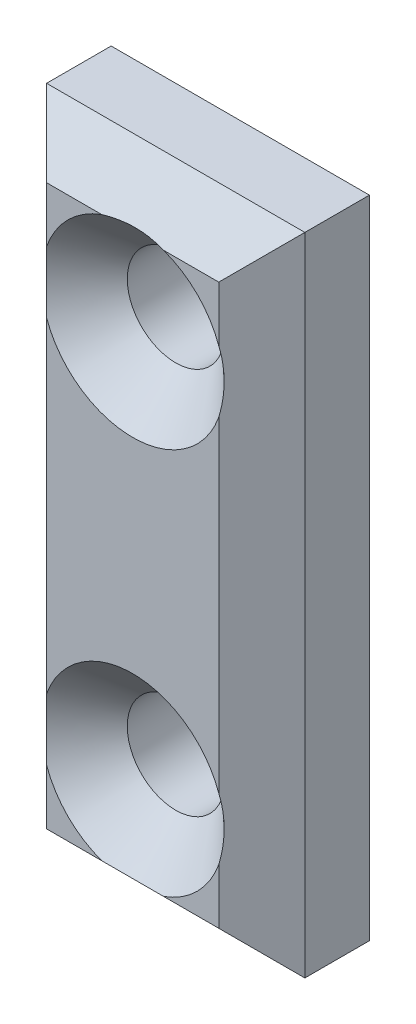
ISO-10303-21;
HEADER;
FILE_DESCRIPTION(('STEP AP214'),'2;1');
FILE_NAME('part.step','',(''),(''),'','','');
FILE_SCHEMA(('AUTOMOTIVE_DESIGN { 1 0 10303 214 1 1 1 1 }'));
ENDSEC;
DATA;
#1=APPLICATION_CONTEXT('core data for automotive mechanical design processes');
#2=APPLICATION_PROTOCOL_DEFINITION('international standard','automotive_design',2000,#1);
#3=PRODUCT_CONTEXT('',#1,'mechanical');
#4=PRODUCT('Part','Part','',(#3));
#5=PRODUCT_RELATED_PRODUCT_CATEGORY('part','',(#4));
#6=PRODUCT_DEFINITION_FORMATION('','',#4);
#7=PRODUCT_DEFINITION_CONTEXT('part definition',#1,'design');
#8=PRODUCT_DEFINITION('design','',#6,#7);
#9=PRODUCT_DEFINITION_SHAPE('','',#8);
#10=(LENGTH_UNIT() NAMED_UNIT(*) SI_UNIT(.MILLI.,.METRE.));
#11=(NAMED_UNIT(*) PLANE_ANGLE_UNIT() SI_UNIT($,.RADIAN.));
#12=(NAMED_UNIT(*) SI_UNIT($,.STERADIAN.) SOLID_ANGLE_UNIT());
#13=UNCERTAINTY_MEASURE_WITH_UNIT(LENGTH_MEASURE(1.E-05),#10,'distance_accuracy_value','');
#14=(GEOMETRIC_REPRESENTATION_CONTEXT(3) GLOBAL_UNCERTAINTY_ASSIGNED_CONTEXT((#13)) GLOBAL_UNIT_ASSIGNED_CONTEXT((#10,
#11,#12)) REPRESENTATION_CONTEXT('',''));
#15=CARTESIAN_POINT('',(0.,0.,0.));
#16=DIRECTION('',(0.,0.,1.));
#17=DIRECTION('',(1.,0.,0.));
#18=AXIS2_PLACEMENT_3D('',#15,#16,#17);
#19=CARTESIAN_POINT('',(0.,0.,5.));
#20=DIRECTION('',(0.,0.,-1.));
#21=DIRECTION('',(-1.,0.,0.));
#22=AXIS2_PLACEMENT_3D('',#19,#20,#21);
#23=PLANE('',#22);
#24=DIRECTION('',(1.,0.,0.));
#25=VECTOR('',#24,1.);
#26=CARTESIAN_POINT('',(0.,45.8000000000001,5.));
#27=LINE('',#26,#25);
#28=CARTESIAN_POINT('',(128.997861571869,45.7999999999999,5.));
#29=VERTEX_POINT('',#28);
#30=CARTESIAN_POINT('',(131.561720910235,45.7999999999999,5.));
#31=VERTEX_POINT('',#30);
#32=EDGE_CURVE('E199',#29,#31,#27,.T.);
#33=ORIENTED_EDGE('',*,*,#32,.T.);
#34=DIRECTION('',(0.,1.,0.));
#35=VECTOR('',#34,1.);
#36=CARTESIAN_POINT('',(131.561720910235,0.,5.));
#37=LINE('',#36,#35);
#38=CARTESIAN_POINT('',(131.561720910235,48.3638593383654,5.));
#39=VERTEX_POINT('',#38);
#40=EDGE_CURVE('E201',#31,#39,#37,.T.);
#41=ORIENTED_EDGE('',*,*,#40,.T.);
#42=CARTESIAN_POINT('',(127.561720910235,49.8,5.));
#43=DIRECTION('',(0.,0.,-1.));
#44=DIRECTION('',(-1.,0.,0.));
#45=AXIS2_PLACEMENT_3D('',#42,#43,#44);
#46=CIRCLE('',#45,4.25000000000003);
#47=EDGE_CURVE('E197',#39,#29,#46,.T.);
#48=ORIENTED_EDGE('',*,*,#47,.T.);
#49=EDGE_LOOP('',(#33,#41,#48));
#50=FACE_BOUND('',#49,.T.);
#51=ADVANCED_FACE('F35',(#50),#23,.F.);
#52=DIRECTION('',(0.,-1.,0.));
#53=VECTOR('',#52,1.);
#54=CARTESIAN_POINT('',(123.561720910235,0.,5.));
#55=LINE('',#54,#53);
#56=CARTESIAN_POINT('',(123.561720910235,48.3638593383654,5.));
#57=VERTEX_POINT('',#56);
#58=CARTESIAN_POINT('',(123.561720910235,45.8,5.));
#59=VERTEX_POINT('',#58);
#60=EDGE_CURVE('E192',#57,#59,#55,.T.);
#61=ORIENTED_EDGE('',*,*,#60,.T.);
#62=DIRECTION('',(1.,0.,0.));
#63=VECTOR('',#62,1.);
#64=CARTESIAN_POINT('',(0.,45.8000000000001,5.));
#65=LINE('',#64,#63);
#66=CARTESIAN_POINT('',(126.1255802486,45.7999999999999,5.));
#67=VERTEX_POINT('',#66);
#68=EDGE_CURVE('E194',#59,#67,#65,.T.);
#69=ORIENTED_EDGE('',*,*,#68,.T.);
#70=CARTESIAN_POINT('',(127.561720910235,49.8,5.));
#71=DIRECTION('',(0.,0.,-1.));
#72=DIRECTION('',(-1.,0.,0.));
#73=AXIS2_PLACEMENT_3D('',#70,#71,#72);
#74=CIRCLE('',#73,4.25000000000003);
#75=EDGE_CURVE('E190',#67,#57,#74,.T.);
#76=ORIENTED_EDGE('',*,*,#75,.T.);
#77=EDGE_LOOP('',(#61,#69,#76));
#78=FACE_BOUND('',#77,.T.);
#79=ADVANCED_FACE('F329',(#78),#23,.F.);
#80=CARTESIAN_POINT('',(127.561720910235,67.7999999999999,5.));
#81=DIRECTION('',(0.,0.,-1.));
#82=DIRECTION('',(-1.,0.,0.));
#83=AXIS2_PLACEMENT_3D('',#80,#81,#82);
#84=CIRCLE('',#83,4.25000000000003);
#85=CARTESIAN_POINT('',(123.561720910235,69.2361406616345,5.));
#86=VERTEX_POINT('',#85);
#87=CARTESIAN_POINT('',(126.1255802486,71.8,5.));
#88=VERTEX_POINT('',#87);
#89=EDGE_CURVE('E183',#86,#88,#84,.T.);
#90=ORIENTED_EDGE('',*,*,#89,.T.);
#91=DIRECTION('',(-1.,0.,0.));
#92=VECTOR('',#91,1.);
#93=CARTESIAN_POINT('',(0.,71.8000000000001,5.));
#94=LINE('',#93,#92);
#95=CARTESIAN_POINT('',(123.561720910235,71.8,5.));
#96=VERTEX_POINT('',#95);
#97=EDGE_CURVE('E187',#88,#96,#94,.T.);
#98=ORIENTED_EDGE('',*,*,#97,.T.);
#99=DIRECTION('',(0.,-1.,0.));
#100=VECTOR('',#99,1.);
#101=CARTESIAN_POINT('',(123.561720910235,0.,5.));
#102=LINE('',#101,#100);
#103=EDGE_CURVE('E185',#96,#86,#102,.T.);
#104=ORIENTED_EDGE('',*,*,#103,.T.);
#105=EDGE_LOOP('',(#90,#98,#104));
#106=FACE_BOUND('',#105,.T.);
#107=ADVANCED_FACE('F334',(#106),#23,.F.);
#108=DIRECTION('',(0.,1.,0.));
#109=VECTOR('',#108,1.);
#110=CARTESIAN_POINT('',(131.561720910235,0.,5.));
#111=LINE('',#110,#109);
#112=CARTESIAN_POINT('',(131.561720910235,69.2361406616345,5.));
#113=VERTEX_POINT('',#112);
#114=CARTESIAN_POINT('',(131.561720910235,71.8,5.));
#115=VERTEX_POINT('',#114);
#116=EDGE_CURVE('E178',#113,#115,#111,.T.);
#117=ORIENTED_EDGE('',*,*,#116,.T.);
#118=DIRECTION('',(-1.,0.,0.));
#119=VECTOR('',#118,1.);
#120=CARTESIAN_POINT('',(0.,71.8000000000001,5.));
#121=LINE('',#120,#119);
#122=CARTESIAN_POINT('',(128.997861571869,71.8,5.));
#123=VERTEX_POINT('',#122);
#124=EDGE_CURVE('E180',#115,#123,#121,.T.);
#125=ORIENTED_EDGE('',*,*,#124,.T.);
#126=CARTESIAN_POINT('',(127.561720910235,67.7999999999999,5.));
#127=DIRECTION('',(0.,0.,-1.));
#128=DIRECTION('',(-1.,0.,0.));
#129=AXIS2_PLACEMENT_3D('',#126,#127,#128);
#130=CIRCLE('',#129,4.25000000000003);
#131=EDGE_CURVE('E176',#123,#113,#130,.T.);
#132=ORIENTED_EDGE('',*,*,#131,.T.);
#133=EDGE_LOOP('',(#117,#125,#132));
#134=FACE_BOUND('',#133,.T.);
#135=ADVANCED_FACE('F339',(#134),#23,.F.);
#136=CARTESIAN_POINT('',(121.561720910235,73.8,5.));
#137=DIRECTION('',(1.,0.,0.));
#138=DIRECTION('',(0.,0.,-1.));
#139=AXIS2_PLACEMENT_3D('',#136,#137,#138);
#140=PLANE('',#139);
#141=DIRECTION('',(0.,0.,-1.));
#142=VECTOR('',#141,1.);
#143=CARTESIAN_POINT('',(121.561720910235,43.8,5.));
#144=LINE('',#143,#142);
#145=CARTESIAN_POINT('',(121.561720910235,43.8,2.99999999999999));
#146=VERTEX_POINT('',#145);
#147=CARTESIAN_POINT('',(121.561720910235,43.8,0.));
#148=VERTEX_POINT('',#147);
#149=EDGE_CURVE('E131',#146,#148,#144,.T.);
#150=ORIENTED_EDGE('',*,*,#149,.F.);
#151=DIRECTION('',(0.,1.,0.));
#152=VECTOR('',#151,1.);
#153=CARTESIAN_POINT('',(121.561720910235,73.8,2.99999999999999));
#154=LINE('',#153,#152);
#155=CARTESIAN_POINT('',(121.561720910235,73.8,2.99999999999999));
#156=VERTEX_POINT('',#155);
#157=EDGE_CURVE('E209',#146,#156,#154,.T.);
#158=ORIENTED_EDGE('',*,*,#157,.T.);
#159=DIRECTION('',(0.,0.,-1.));
#160=VECTOR('',#159,1.);
#161=CARTESIAN_POINT('',(121.561720910235,73.8,5.));
#162=LINE('',#161,#160);
#163=CARTESIAN_POINT('',(121.561720910235,73.8,0.));
#164=VERTEX_POINT('',#163);
#165=EDGE_CURVE('E152',#156,#164,#162,.T.);
#166=ORIENTED_EDGE('',*,*,#165,.T.);
#167=DIRECTION('',(0.,-1.,0.));
#168=VECTOR('',#167,1.);
#169=CARTESIAN_POINT('',(121.561720910235,73.8,0.));
#170=LINE('',#169,#168);
#171=EDGE_CURVE('E146',#164,#148,#170,.T.);
#172=ORIENTED_EDGE('',*,*,#171,.T.);
#173=EDGE_LOOP('',(#150,#158,#166,#172));
#174=FACE_BOUND('',#173,.T.);
#175=ADVANCED_FACE('F150',(#174),#140,.F.);
#176=CARTESIAN_POINT('',(133.561720910235,43.7999999999999,5.));
#177=DIRECTION('',(0.,1.,0.));
#178=DIRECTION('',(-1.,0.,0.));
#179=AXIS2_PLACEMENT_3D('',#176,#177,#178);
#180=PLANE('',#179);
#181=DIRECTION('',(0.,0.,-1.));
#182=VECTOR('',#181,1.);
#183=CARTESIAN_POINT('',(133.561720910235,43.7999999999999,5.));
#184=LINE('',#183,#182);
#185=CARTESIAN_POINT('',(133.561720910235,43.7999999999999,2.99999999999999));
#186=VERTEX_POINT('',#185);
#187=CARTESIAN_POINT('',(133.561720910235,43.7999999999999,0.));
#188=VERTEX_POINT('',#187);
#189=EDGE_CURVE('E140',#186,#188,#184,.T.);
#190=ORIENTED_EDGE('',*,*,#189,.F.);
#191=DIRECTION('',(-1.,0.,0.));
#192=VECTOR('',#191,1.);
#193=CARTESIAN_POINT('',(133.561720910235,43.7999999999999,2.99999999999999));
#194=LINE('',#193,#192);
#195=EDGE_CURVE('E58',#186,#146,#194,.T.);
#196=ORIENTED_EDGE('',*,*,#195,.T.);
#197=ORIENTED_EDGE('',*,*,#149,.T.);
#198=DIRECTION('',(1.,0.,0.));
#199=VECTOR('',#198,1.);
#200=CARTESIAN_POINT('',(133.561720910235,43.7999999999999,0.));
#201=LINE('',#200,#199);
#202=EDGE_CURVE('E134',#148,#188,#201,.T.);
#203=ORIENTED_EDGE('',*,*,#202,.T.);
#204=EDGE_LOOP('',(#190,#196,#197,#203));
#205=FACE_BOUND('',#204,.T.);
#206=ADVANCED_FACE('F133',(#205),#180,.F.);
#207=CARTESIAN_POINT('',(133.561720910235,73.8,5.));
#208=DIRECTION('',(-1.,0.,0.));
#209=DIRECTION('',(0.,0.,1.));
#210=AXIS2_PLACEMENT_3D('',#207,#208,#209);
#211=PLANE('',#210);
#212=DIRECTION('',(0.,0.,-1.));
#213=VECTOR('',#212,1.);
#214=CARTESIAN_POINT('',(133.561720910235,73.8,5.));
#215=LINE('',#214,#213);
#216=CARTESIAN_POINT('',(133.561720910235,73.8,2.99999999999999));
#217=VERTEX_POINT('',#216);
#218=CARTESIAN_POINT('',(133.561720910235,73.8,0.));
#219=VERTEX_POINT('',#218);
#220=EDGE_CURVE('E165',#217,#219,#215,.T.);
#221=ORIENTED_EDGE('',*,*,#220,.F.);
#222=DIRECTION('',(0.,-1.,0.));
#223=VECTOR('',#222,1.);
#224=CARTESIAN_POINT('',(133.561720910235,73.8,2.99999999999999));
#225=LINE('',#224,#223);
#226=EDGE_CURVE('E66',#217,#186,#225,.T.);
#227=ORIENTED_EDGE('',*,*,#226,.T.);
#228=ORIENTED_EDGE('',*,*,#189,.T.);
#229=DIRECTION('',(0.,1.,0.));
#230=VECTOR('',#229,1.);
#231=CARTESIAN_POINT('',(133.561720910235,73.8,0.));
#232=LINE('',#231,#230);
#233=EDGE_CURVE('E148',#188,#219,#232,.T.);
#234=ORIENTED_EDGE('',*,*,#233,.T.);
#235=EDGE_LOOP('',(#221,#227,#228,#234));
#236=FACE_BOUND('',#235,.T.);
#237=ADVANCED_FACE('F343',(#236),#211,.F.);
#238=CARTESIAN_POINT('',(133.561720910235,73.8,5.));
#239=DIRECTION('',(0.,-1.,0.));
#240=DIRECTION('',(1.,0.,0.));
#241=AXIS2_PLACEMENT_3D('',#238,#239,#240);
#242=PLANE('',#241);
#243=ORIENTED_EDGE('',*,*,#165,.F.);
#244=DIRECTION('',(1.,0.,0.));
#245=VECTOR('',#244,1.);
#246=CARTESIAN_POINT('',(133.561720910235,73.8,2.99999999999999));
#247=LINE('',#246,#245);
#248=EDGE_CURVE('E204',#156,#217,#247,.T.);
#249=ORIENTED_EDGE('',*,*,#248,.T.);
#250=ORIENTED_EDGE('',*,*,#220,.T.);
#251=DIRECTION('',(-1.,0.,0.));
#252=VECTOR('',#251,1.);
#253=CARTESIAN_POINT('',(133.561720910235,73.8,0.));
#254=LINE('',#253,#252);
#255=EDGE_CURVE('E162',#219,#164,#254,.T.);
#256=ORIENTED_EDGE('',*,*,#255,.T.);
#257=EDGE_LOOP('',(#243,#249,#250,#256));
#258=FACE_BOUND('',#257,.T.);
#259=ADVANCED_FACE('F337',(#258),#242,.F.);
#260=DIRECTION('',(0.,-1.,0.));
#261=VECTOR('',#260,1.);
#262=CARTESIAN_POINT('',(123.561720910235,0.,5.));
#263=LINE('',#262,#261);
#264=CARTESIAN_POINT('',(123.561720910235,66.3638593383654,5.));
#265=VERTEX_POINT('',#264);
#266=CARTESIAN_POINT('',(123.561720910235,51.2361406616345,5.));
#267=VERTEX_POINT('',#266);
#268=EDGE_CURVE('E169',#265,#267,#263,.T.);
#269=ORIENTED_EDGE('',*,*,#268,.T.);
#270=CARTESIAN_POINT('',(127.561720910235,49.8,5.));
#271=DIRECTION('',(0.,0.,-1.));
#272=DIRECTION('',(-1.,0.,0.));
#273=AXIS2_PLACEMENT_3D('',#270,#271,#272);
#274=CIRCLE('',#273,4.25000000000003);
#275=CARTESIAN_POINT('',(131.561720910235,51.2361406616345,5.));
#276=VERTEX_POINT('',#275);
#277=EDGE_CURVE('E174',#267,#276,#274,.T.);
#278=ORIENTED_EDGE('',*,*,#277,.T.);
#279=DIRECTION('',(0.,1.,0.));
#280=VECTOR('',#279,1.);
#281=CARTESIAN_POINT('',(131.561720910235,0.,5.));
#282=LINE('',#281,#280);
#283=CARTESIAN_POINT('',(131.561720910235,66.3638593383653,5.));
#284=VERTEX_POINT('',#283);
#285=EDGE_CURVE('E171',#276,#284,#282,.T.);
#286=ORIENTED_EDGE('',*,*,#285,.T.);
#287=CARTESIAN_POINT('',(127.561720910235,67.7999999999999,5.));
#288=DIRECTION('',(0.,0.,-1.));
#289=DIRECTION('',(-1.,0.,0.));
#290=AXIS2_PLACEMENT_3D('',#287,#288,#289);
#291=CIRCLE('',#290,4.25000000000003);
#292=EDGE_CURVE('E139',#284,#265,#291,.T.);
#293=ORIENTED_EDGE('',*,*,#292,.T.);
#294=EDGE_LOOP('',(#269,#278,#286,#293));
#295=FACE_BOUND('',#294,.T.);
#296=ADVANCED_FACE('F324',(#295),#23,.F.);
#297=CARTESIAN_POINT('',(0.,0.,0.));
#298=DIRECTION('',(0.,0.,-1.));
#299=DIRECTION('',(-1.,0.,0.));
#300=AXIS2_PLACEMENT_3D('',#297,#298,#299);
#301=PLANE('',#300);
#302=CARTESIAN_POINT('',(127.561720910235,67.7999999999999,0.));
#303=DIRECTION('',(0.,0.,1.));
#304=DIRECTION('',(1.,0.,0.));
#305=AXIS2_PLACEMENT_3D('',#302,#303,#304);
#306=CIRCLE('',#305,2.25000000000001);
#307=CARTESIAN_POINT('',(129.811720910235,67.7999999999999,0.));
#308=VERTEX_POINT('',#307);
#309=EDGE_CURVE('E154',#308,#308,#306,.T.);
#310=ORIENTED_EDGE('',*,*,#309,.T.);
#311=EDGE_LOOP('',(#310));
#312=FACE_BOUND('',#311,.T.);
#313=CARTESIAN_POINT('',(127.561720910235,49.8,0.));
#314=DIRECTION('',(0.,0.,1.));
#315=DIRECTION('',(1.,0.,0.));
#316=AXIS2_PLACEMENT_3D('',#313,#314,#315);
#317=CIRCLE('',#316,2.25000000000001);
#318=CARTESIAN_POINT('',(129.811720910235,49.8,0.));
#319=VERTEX_POINT('',#318);
#320=EDGE_CURVE('E157',#319,#319,#317,.T.);
#321=ORIENTED_EDGE('',*,*,#320,.T.);
#322=EDGE_LOOP('',(#321));
#323=FACE_BOUND('',#322,.T.);
#324=ORIENTED_EDGE('',*,*,#171,.F.);
#325=ORIENTED_EDGE('',*,*,#255,.F.);
#326=ORIENTED_EDGE('',*,*,#233,.F.);
#327=ORIENTED_EDGE('',*,*,#202,.F.);
#328=EDGE_LOOP('',(#324,#325,#326,#327));
#329=FACE_BOUND('',#328,.T.);
#330=ADVANCED_FACE('F144',(#312,#323,#329),#301,.T.);
#331=CARTESIAN_POINT('',(127.561720910235,49.8,0.));
#332=DIRECTION('',(0.,0.,1.));
#333=DIRECTION('',(1.,0.,0.));
#334=AXIS2_PLACEMENT_3D('',#331,#332,#333);
#335=CYLINDRICAL_SURFACE('',#334,2.25000000000001);
#336=CARTESIAN_POINT('',(127.561720910235,49.8,3.00000000000001));
#337=DIRECTION('',(0.,0.,-1.));
#338=DIRECTION('',(-1.,0.,0.));
#339=AXIS2_PLACEMENT_3D('',#336,#337,#338);
#340=CIRCLE('',#339,2.25000000000001);
#341=CARTESIAN_POINT('',(125.311720910235,49.8,3.00000000000001));
#342=VERTEX_POINT('',#341);
#343=EDGE_CURVE('E50',#342,#342,#340,.F.);
#344=ORIENTED_EDGE('',*,*,#343,.T.);
#345=EDGE_LOOP('',(#344));
#346=FACE_BOUND('',#345,.T.);
#347=ORIENTED_EDGE('',*,*,#320,.F.);
#348=EDGE_LOOP('',(#347));
#349=FACE_BOUND('',#348,.T.);
#350=ADVANCED_FACE('F313',(#346,#349),#335,.F.);
#351=CARTESIAN_POINT('',(127.561720910235,67.7999999999999,0.));
#352=DIRECTION('',(0.,0.,1.));
#353=DIRECTION('',(1.,0.,0.));
#354=AXIS2_PLACEMENT_3D('',#351,#352,#353);
#355=CYLINDRICAL_SURFACE('',#354,2.25000000000001);
#356=CARTESIAN_POINT('',(127.561720910235,67.7999999999999,3.00000000000001));
#357=DIRECTION('',(0.,0.,-1.));
#358=DIRECTION('',(-1.,0.,0.));
#359=AXIS2_PLACEMENT_3D('',#356,#357,#358);
#360=CIRCLE('',#359,2.25000000000001);
#361=CARTESIAN_POINT('',(125.311720910235,67.7999999999999,3.00000000000001));
#362=VERTEX_POINT('',#361);
#363=EDGE_CURVE('E11',#362,#362,#360,.F.);
#364=ORIENTED_EDGE('',*,*,#363,.T.);
#365=EDGE_LOOP('',(#364));
#366=FACE_BOUND('',#365,.T.);
#367=ORIENTED_EDGE('',*,*,#309,.F.);
#368=EDGE_LOOP('',(#367));
#369=FACE_BOUND('',#368,.T.);
#370=ADVANCED_FACE('F315',(#366,#369),#355,.F.);
#371=CARTESIAN_POINT('',(127.561720910235,49.8,3.00000000000001));
#372=DIRECTION('',(0.,0.,1.));
#373=DIRECTION('',(1.,0.,0.));
#374=AXIS2_PLACEMENT_3D('',#371,#372,#373);
#375=CONICAL_SURFACE('',#374,2.25000000000001,0.785398163397452);
#376=ORIENTED_EDGE('',*,*,#343,.F.);
#377=EDGE_LOOP('',(#376));
#378=FACE_BOUND('',#377,.T.);
#379=CARTESIAN_POINT('',(123.561920910235,48.3627108850338,5.00020000000001));
#380=CARTESIAN_POINT('',(123.547414359578,48.4459722404877,4.98569344934279));
#381=CARTESIAN_POINT('',(123.534099835369,48.5296410151836,4.97237892513408));
#382=CARTESIAN_POINT('',(123.509933883969,48.6976953628991,4.94821297373448));
#383=CARTESIAN_POINT('',(123.499082711793,48.7820810091941,4.93736180155781));
#384=CARTESIAN_POINT('',(123.47034140915,49.0361892496429,4.9086204989152));
#385=CARTESIAN_POINT('',(123.456271993907,49.2068147653422,4.89455108367239));
#386=CARTESIAN_POINT('',(123.438937630064,49.545630527511,4.87721671982945));
#387=CARTESIAN_POINT('',(123.435457730987,49.713799271163,4.87373682075224));
#388=CARTESIAN_POINT('',(123.438795746973,50.0498611499362,4.87707483673857));
#389=CARTESIAN_POINT('',(123.44560747198,50.2177543899721,4.88388656174535));
#390=CARTESIAN_POINT('',(123.462520304693,50.4563670753133,4.90079939445824));
#391=CARTESIAN_POINT('',(123.468508363419,50.5277136689155,4.90678745318428));
#392=CARTESIAN_POINT('',(123.482292231733,50.670047129047,4.92057132149821));
#393=CARTESIAN_POINT('',(123.490087744357,50.7410340527142,4.92836683412231));
#394=CARTESIAN_POINT('',(123.516278187135,50.9546084061553,4.95455727690008));
#395=CARTESIAN_POINT('',(123.537386260604,51.0965420152081,4.97566535036883));
#396=CARTESIAN_POINT('',(123.561920910235,51.2372891149672,5.00020000000019));
#397=B_SPLINE_CURVE_WITH_KNOTS('',3,(#379,#380,#381,#382,#383,#384,#385,#386,#387,#388,#389,
#390,#391,#392,#393,#394,#395,#396),.UNSPECIFIED.,.F.,.F.,(4,2,2,2,2,2,2,2,4),(0.,
0.257219659565787,0.514465935216324,1.02910756528189,1.53323066046739,2.03705066369039,
2.2525567742225,2.46802750226489,2.90278147625325),.UNSPECIFIED.);
#398=EDGE_CURVE('E253',#57,#267,#397,.T.);
#399=ORIENTED_EDGE('',*,*,#398,.F.);
#400=ORIENTED_EDGE('',*,*,#75,.F.);
#401=CARTESIAN_POINT('',(128.999010025201,45.8002,5.00020000000001));
#402=CARTESIAN_POINT('',(128.915748669747,45.7856934493427,4.98569344934279));
#403=CARTESIAN_POINT('',(128.832079895051,45.772378925134,4.97237892513408));
#404=CARTESIAN_POINT('',(128.664025547336,45.7482129737344,4.94821297373448));
#405=CARTESIAN_POINT('',(128.579639901041,45.7373618015578,4.93736180155781));
#406=CARTESIAN_POINT('',(128.325531660592,45.7086204989151,4.9086204989152));
#407=CARTESIAN_POINT('',(128.154906144893,45.6945510836723,4.89455108367239));
#408=CARTESIAN_POINT('',(127.816090382724,45.6772167198294,4.87721671982945));
#409=CARTESIAN_POINT('',(127.647921639072,45.6737368207522,4.87373682075224));
#410=CARTESIAN_POINT('',(127.311859760299,45.6770748367385,4.87707483673856));
#411=CARTESIAN_POINT('',(127.143966520263,45.6838865617453,4.88388656174535));
#412=CARTESIAN_POINT('',(126.905353834921,45.7007993944582,4.90079939445824));
#413=CARTESIAN_POINT('',(126.834007241319,45.7067874531842,4.90678745318428));
#414=CARTESIAN_POINT('',(126.691673781188,45.7205713214982,4.92057132149821));
#415=CARTESIAN_POINT('',(126.620686857521,45.7283668341223,4.92836683412231));
#416=CARTESIAN_POINT('',(126.407112504079,45.7545572769,4.95455727690008));
#417=CARTESIAN_POINT('',(126.265178895027,45.7756653503688,4.97566535036882));
#418=CARTESIAN_POINT('',(126.124431795268,45.8002000000001,5.00020000000019));
#419=B_SPLINE_CURVE_WITH_KNOTS('',3,(#401,#402,#403,#404,#405,#406,#407,#408,#409,#410,#411,
#412,#413,#414,#415,#416,#417,#418),.UNSPECIFIED.,.F.,.F.,(4,2,2,2,2,2,2,2,4),(0.,
0.257219659565807,0.514465935216332,1.0291075652819,1.53323066046741,2.03705066369043,
2.25255677422251,2.46802750226491,2.90278147625329),.UNSPECIFIED.);
#420=EDGE_CURVE('E40',#29,#67,#419,.T.);
#421=ORIENTED_EDGE('',*,*,#420,.F.);
#422=ORIENTED_EDGE('',*,*,#47,.F.);
#423=CARTESIAN_POINT('',(131.561520910235,51.2372891149661,5.00020000000001));
#424=CARTESIAN_POINT('',(131.576027460892,51.1540277595123,4.98569344934279));
#425=CARTESIAN_POINT('',(131.589341985101,51.0703589848163,4.97237892513408));
#426=CARTESIAN_POINT('',(131.6135079365,50.9023046371009,4.94821297373448));
#427=CARTESIAN_POINT('',(131.624359108677,50.8179189908058,4.93736180155781));
#428=CARTESIAN_POINT('',(131.65310041132,50.5638107503571,4.90862049891519));
#429=CARTESIAN_POINT('',(131.667169826562,50.3931852346578,4.89455108367238));
#430=CARTESIAN_POINT('',(131.684504190405,50.0543694724889,4.87721671982944));
#431=CARTESIAN_POINT('',(131.687984089483,49.886200728837,4.87373682075224));
#432=CARTESIAN_POINT('',(131.684646073496,49.5501388500637,4.87707483673856));
#433=CARTESIAN_POINT('',(131.677834348489,49.3822456100279,4.88388656174534));
#434=CARTESIAN_POINT('',(131.660921515777,49.1436329246867,4.90079939445823));
#435=CARTESIAN_POINT('',(131.654933457051,49.0722863310846,4.90678745318426));
#436=CARTESIAN_POINT('',(131.641149588737,48.9299528709533,4.92057132149817));
#437=CARTESIAN_POINT('',(131.633354076113,48.8589659472862,4.92836683412226));
#438=CARTESIAN_POINT('',(131.607163633335,48.6453915938453,4.95455727689998));
#439=CARTESIAN_POINT('',(131.586055559866,48.5034579847927,4.97566535036868));
#440=CARTESIAN_POINT('',(131.561520910235,48.3627108850338,5.00020000000001));
#441=B_SPLINE_CURVE_WITH_KNOTS('',3,(#423,#424,#425,#426,#427,#428,#429,#430,#431,#432,#433,
#434,#435,#436,#437,#438,#439,#440),.UNSPECIFIED.,.F.,.F.,(4,2,2,2,2,2,2,2,4),(0.,
0.257219659565792,0.514465935216331,1.02910756528189,1.53323066046741,2.03705066369041,
2.25255677422226,2.46802750226438,2.90278147625222),.UNSPECIFIED.);
#442=EDGE_CURVE('E295',#276,#39,#441,.T.);
#443=ORIENTED_EDGE('',*,*,#442,.F.);
#444=ORIENTED_EDGE('',*,*,#277,.F.);
#445=EDGE_LOOP('',(#399,#400,#421,#422,#443,#444));
#446=FACE_BOUND('',#445,.T.);
#447=ADVANCED_FACE('F272',(#378,#446),#375,.F.);
#448=CARTESIAN_POINT('',(0.,45.8000000000001,5.));
#449=DIRECTION('',(0.,0.707106781186552,-0.707106781186544));
#450=DIRECTION('',(1.,0.,0.));
#451=AXIS2_PLACEMENT_3D('',#448,#449,#450);
#452=PLANE('',#451);
#453=DIRECTION('',(0.577350269189624,0.577350269189623,0.57735026918963));
#454=VECTOR('',#453,1.);
#455=CARTESIAN_POINT('',(108.295054243568,30.5333333333334,-10.2666666666667));
#456=LINE('',#455,#454);
#457=EDGE_CURVE('E361',#146,#59,#456,.T.);
#458=ORIENTED_EDGE('',*,*,#457,.F.);
#459=ORIENTED_EDGE('',*,*,#195,.F.);
#460=DIRECTION('',(-0.577350269189626,0.577350269189623,0.577350269189628));
#461=VECTOR('',#460,1.);
#462=CARTESIAN_POINT('',(87.7078139401564,89.653906970078,48.8539069700785));
#463=LINE('',#462,#461);
#464=EDGE_CURVE('E300',#31,#186,#463,.F.);
#465=ORIENTED_EDGE('',*,*,#464,.F.);
#466=ORIENTED_EDGE('',*,*,#32,.F.);
#467=ORIENTED_EDGE('',*,*,#420,.T.);
#468=ORIENTED_EDGE('',*,*,#68,.F.);
#469=EDGE_LOOP('',(#458,#459,#465,#466,#467,#468));
#470=FACE_BOUND('',#469,.T.);
#471=ADVANCED_FACE('F38',(#470),#452,.F.);
#472=CARTESIAN_POINT('',(131.561720910235,0.,5.));
#473=DIRECTION('',(-0.707106781186549,0.,-0.707106781186546));
#474=DIRECTION('',(0.,1.,0.));
#475=AXIS2_PLACEMENT_3D('',#472,#473,#474);
#476=PLANE('',#475);
#477=DIRECTION('',(-0.577350269189628,-0.57735026918962,0.57735026918963));
#478=VECTOR('',#477,1.);
#479=CARTESIAN_POINT('',(107.628387576902,47.8666666666672,28.9333333333332));
#480=LINE('',#479,#478);
#481=EDGE_CURVE('E223',#115,#217,#480,.F.);
#482=ORIENTED_EDGE('',*,*,#481,.F.);
#483=ORIENTED_EDGE('',*,*,#116,.F.);
#484=CARTESIAN_POINT('',(131.21318303772,70.5952414737353,5.34853787251455));
#485=CARTESIAN_POINT('',(131.274329711161,70.4148691476743,5.28739119907409));
#486=CARTESIAN_POINT('',(131.330655840786,70.2310713136063,5.23106506944846));
#487=CARTESIAN_POINT('',(131.432350523485,69.8571766375346,5.12937038674944));
#488=CARTESIAN_POINT('',(131.477700462941,69.66706970855,5.0840204472939));
#489=CARTESIAN_POINT('',(131.555729310407,69.2826165827944,5.00599159982818));
#490=CARTESIAN_POINT('',(131.588466058579,69.0882941603962,4.97325485165576));
#491=CARTESIAN_POINT('',(131.640374110665,68.6961633348249,4.92134679956968));
#492=CARTESIAN_POINT('',(131.659554804969,68.4983574422204,4.90216610526554));
#493=CARTESIAN_POINT('',(131.682927008403,68.1124892238344,4.8787939018313));
#494=CARTESIAN_POINT('',(131.687920412699,67.9245241468431,4.87380049753553));
#495=CARTESIAN_POINT('',(131.685034770683,67.5487516498418,4.87668613955154));
#496=CARTESIAN_POINT('',(131.677153098211,67.3609442698158,4.88456781202408));
#497=CARTESIAN_POINT('',(131.648812207151,66.9873668711946,4.91290870308413));
#498=CARTESIAN_POINT('',(131.628360266974,66.8015957368866,4.93336064326044));
#499=CARTESIAN_POINT('',(131.575607751438,66.4335289046786,4.98611315879646));
#500=CARTESIAN_POINT('',(131.543310461455,66.2512322578433,5.01841044877944));
#501=CARTESIAN_POINT('',(131.467201006509,65.8880291550758,5.09451990372585));
#502=CARTESIAN_POINT('',(131.42319413055,65.7072051876709,5.13852677968518));
#503=CARTESIAN_POINT('',(131.325293171897,65.3514845659746,5.23642773833784));
#504=CARTESIAN_POINT('',(131.271423647699,65.176574439899,5.29029726253597));
#505=CARTESIAN_POINT('',(131.213183037721,65.0047585262657,5.34853787251416));
#506=B_SPLINE_CURVE_WITH_KNOTS('',3,(#484,#485,#486,#487,#488,#489,#490,#491,#492,#493,#494,
#495,#496,#497,#498,#499,#500,#501,#502,#503,#504,#505),.UNSPECIFIED.,.F.,.F.,(4,2,2,2,2,2,2,2,
2,2,4),(0.,0.600159724786935,1.20133018994964,1.79971009826227,2.39767509652453,
2.96109644952211,3.52463273929528,4.08784303840992,4.65089724585516,5.22397269343795,
5.79564009660929),.UNSPECIFIED.);
#507=EDGE_CURVE('E252',#284,#113,#506,.F.);
#508=ORIENTED_EDGE('',*,*,#507,.F.);
#509=ORIENTED_EDGE('',*,*,#285,.F.);
#510=ORIENTED_EDGE('',*,*,#442,.T.);
#511=ORIENTED_EDGE('',*,*,#40,.F.);
#512=ORIENTED_EDGE('',*,*,#464,.T.);
#513=ORIENTED_EDGE('',*,*,#226,.F.);
#514=EDGE_LOOP('',(#482,#483,#508,#509,#510,#511,#512,#513));
#515=FACE_BOUND('',#514,.T.);
#516=ADVANCED_FACE('F237',(#515),#476,.F.);
#517=CARTESIAN_POINT('',(127.561720910235,67.7999999999999,3.00000000000001));
#518=DIRECTION('',(0.,0.,1.));
#519=DIRECTION('',(1.,0.,0.));
#520=AXIS2_PLACEMENT_3D('',#517,#518,#519);
#521=CONICAL_SURFACE('',#520,2.25000000000001,0.785398163397452);
#522=ORIENTED_EDGE('',*,*,#363,.F.);
#523=EDGE_LOOP('',(#522));
#524=FACE_BOUND('',#523,.T.);
#525=CARTESIAN_POINT('',(126.124431795269,71.7998,5.00020000000001));
#526=CARTESIAN_POINT('',(126.207693150723,71.8143065506572,4.98569344934279));
#527=CARTESIAN_POINT('',(126.291361925419,71.8276210748659,4.97237892513408));
#528=CARTESIAN_POINT('',(126.459416273134,71.8517870262655,4.94821297373449));
#529=CARTESIAN_POINT('',(126.543801919429,71.8626381984422,4.93736180155781));
#530=CARTESIAN_POINT('',(126.797910159878,71.8913795010848,4.90862049891521));
#531=CARTESIAN_POINT('',(126.968535675577,71.9054489163276,4.8945510836724));
#532=CARTESIAN_POINT('',(127.307351437746,71.9227832801705,4.87721671982946));
#533=CARTESIAN_POINT('',(127.475520181398,71.9262631792477,4.87373682075225));
#534=CARTESIAN_POINT('',(127.811582060171,71.9229251632614,4.87707483673858));
#535=CARTESIAN_POINT('',(127.979475300207,71.9161134382546,4.88388656174536));
#536=CARTESIAN_POINT('',(128.218087985548,71.8992006055417,4.90079939445825));
#537=CARTESIAN_POINT('',(128.28943457915,71.8932125468157,4.90678745318428));
#538=CARTESIAN_POINT('',(128.431768039281,71.8794286785018,4.92057132149818));
#539=CARTESIAN_POINT('',(128.502754962949,71.8716331658777,4.92836683412227));
#540=CARTESIAN_POINT('',(128.716329316389,71.8454427231,4.95455727689998));
#541=CARTESIAN_POINT('',(128.858262925442,71.8243346496313,4.97566535036868));
#542=CARTESIAN_POINT('',(128.999010025201,71.7998,5.00020000000001));
#543=B_SPLINE_CURVE_WITH_KNOTS('',3,(#525,#526,#527,#528,#529,#530,#531,#532,#533,#534,#535,
#536,#537,#538,#539,#540,#541,#542),.UNSPECIFIED.,.F.,.F.,(4,2,2,2,2,2,2,2,4),(0.,
0.257219659565808,0.514465935216331,1.02910756528187,1.53323066046741,2.03705066369041,
2.25255677422218,2.46802750226429,2.90278147625209),.UNSPECIFIED.);
#544=EDGE_CURVE('E215',#88,#123,#543,.T.);
#545=ORIENTED_EDGE('',*,*,#544,.F.);
#546=ORIENTED_EDGE('',*,*,#89,.F.);
#547=CARTESIAN_POINT('',(123.910258782749,65.0047585262658,5.34853787251416));
#548=CARTESIAN_POINT('',(123.849112109308,65.1851308523268,5.28739119907373));
#549=CARTESIAN_POINT('',(123.792785979683,65.3689286863947,5.23106506944813));
#550=CARTESIAN_POINT('',(123.691091296984,65.7428233624664,5.12937038674917));
#551=CARTESIAN_POINT('',(123.645741357528,65.932930291451,5.08402044729367));
#552=CARTESIAN_POINT('',(123.567712510063,66.3173834172065,5.00599159982801));
#553=CARTESIAN_POINT('',(123.53497576189,66.5117058396047,4.97325485165561));
#554=CARTESIAN_POINT('',(123.483067709804,66.9038366651759,4.92134679956958));
#555=CARTESIAN_POINT('',(123.4638870155,67.1016425577804,4.90216610526547));
#556=CARTESIAN_POINT('',(123.440514812066,67.4875107761663,4.87879390183128));
#557=CARTESIAN_POINT('',(123.43552140777,67.6754758531576,4.87380049753553));
#558=CARTESIAN_POINT('',(123.438407049786,68.0512483501589,4.87668613955157));
#559=CARTESIAN_POINT('',(123.446288722259,68.2390557301848,4.88456781202412));
#560=CARTESIAN_POINT('',(123.474629613319,68.612633128806,4.9129087030842));
#561=CARTESIAN_POINT('',(123.495081553495,68.7984042631139,4.93336064326053));
#562=CARTESIAN_POINT('',(123.547834069031,69.1664710953218,4.98611315879656));
#563=CARTESIAN_POINT('',(123.580131359014,69.3487677421571,5.01841044877955));
#564=CARTESIAN_POINT('',(123.656240813961,69.7119708449247,5.094519903726));
#565=CARTESIAN_POINT('',(123.70024768992,69.8927948123297,5.13852677968537));
#566=CARTESIAN_POINT('',(123.798148648573,70.2485154340263,5.23642773833813));
#567=CARTESIAN_POINT('',(123.852018172771,70.423425560102,5.29029726253632));
#568=CARTESIAN_POINT('',(123.910258782749,70.5952414737353,5.34853787251455));
#569=B_SPLINE_CURVE_WITH_KNOTS('',3,(#547,#548,#549,#550,#551,#552,#553,#554,#555,#556,#557,
#558,#559,#560,#561,#562,#563,#564,#565,#566,#567,#568),.UNSPECIFIED.,.F.,.F.,(4,2,2,2,2,2,2,2,
2,2,4),(0.,0.600159724786813,1.20133018994942,1.79971009826191,2.39767509652407,
2.96109644952158,3.52463273929467,4.08784303840922,4.65089724585438,5.22397269343755,
5.79564009660926),.UNSPECIFIED.);
#570=EDGE_CURVE('E243',#265,#86,#569,.T.);
#571=ORIENTED_EDGE('',*,*,#570,.F.);
#572=ORIENTED_EDGE('',*,*,#292,.F.);
#573=ORIENTED_EDGE('',*,*,#507,.T.);
#574=ORIENTED_EDGE('',*,*,#131,.F.);
#575=EDGE_LOOP('',(#545,#546,#571,#572,#573,#574));
#576=FACE_BOUND('',#575,.T.);
#577=ADVANCED_FACE('F229',(#524,#576),#521,.F.);
#578=CARTESIAN_POINT('',(123.561720910235,0.,5.));
#579=DIRECTION('',(0.707106781186551,0.,-0.707106781186544));
#580=DIRECTION('',(0.,-1.,0.));
#581=AXIS2_PLACEMENT_3D('',#578,#579,#580);
#582=PLANE('',#581);
#583=ORIENTED_EDGE('',*,*,#570,.T.);
#584=ORIENTED_EDGE('',*,*,#103,.F.);
#585=DIRECTION('',(-0.577350269189625,0.577350269189622,-0.577350269189631));
#586=VECTOR('',#585,1.);
#587=CARTESIAN_POINT('',(147.495054243568,47.866666666667,28.9333333333334));
#588=LINE('',#587,#586);
#589=EDGE_CURVE('E213',#156,#96,#588,.F.);
#590=ORIENTED_EDGE('',*,*,#589,.F.);
#591=ORIENTED_EDGE('',*,*,#157,.F.);
#592=ORIENTED_EDGE('',*,*,#457,.T.);
#593=ORIENTED_EDGE('',*,*,#60,.F.);
#594=ORIENTED_EDGE('',*,*,#398,.T.);
#595=ORIENTED_EDGE('',*,*,#268,.F.);
#596=EDGE_LOOP('',(#583,#584,#590,#591,#592,#593,#594,#595));
#597=FACE_BOUND('',#596,.T.);
#598=ADVANCED_FACE('F236',(#597),#582,.F.);
#599=CARTESIAN_POINT('',(0.,71.8000000000001,5.));
#600=DIRECTION('',(0.,-0.707106781186553,-0.707106781186542));
#601=DIRECTION('',(-1.,0.,0.));
#602=AXIS2_PLACEMENT_3D('',#599,#600,#601);
#603=PLANE('',#602);
#604=ORIENTED_EDGE('',*,*,#481,.T.);
#605=ORIENTED_EDGE('',*,*,#248,.F.);
#606=ORIENTED_EDGE('',*,*,#589,.T.);
#607=ORIENTED_EDGE('',*,*,#97,.F.);
#608=ORIENTED_EDGE('',*,*,#544,.T.);
#609=ORIENTED_EDGE('',*,*,#124,.F.);
#610=EDGE_LOOP('',(#604,#605,#606,#607,#608,#609));
#611=FACE_BOUND('',#610,.T.);
#612=ADVANCED_FACE('F239',(#611),#603,.F.);
#613=CLOSED_SHELL('',(#51,#79,#107,#135,#175,#206,#237,#259,#296,#330,#350,#370,#447,#471,#516,
#577,#598,#612));
#614=MANIFOLD_SOLID_BREP('B2',#613);
#615=ADVANCED_BREP_SHAPE_REPRESENTATION('',(#18,#614),#14);
#616=SHAPE_DEFINITION_REPRESENTATION(#9,#615);
ENDSEC;
END-ISO-10303-21;
